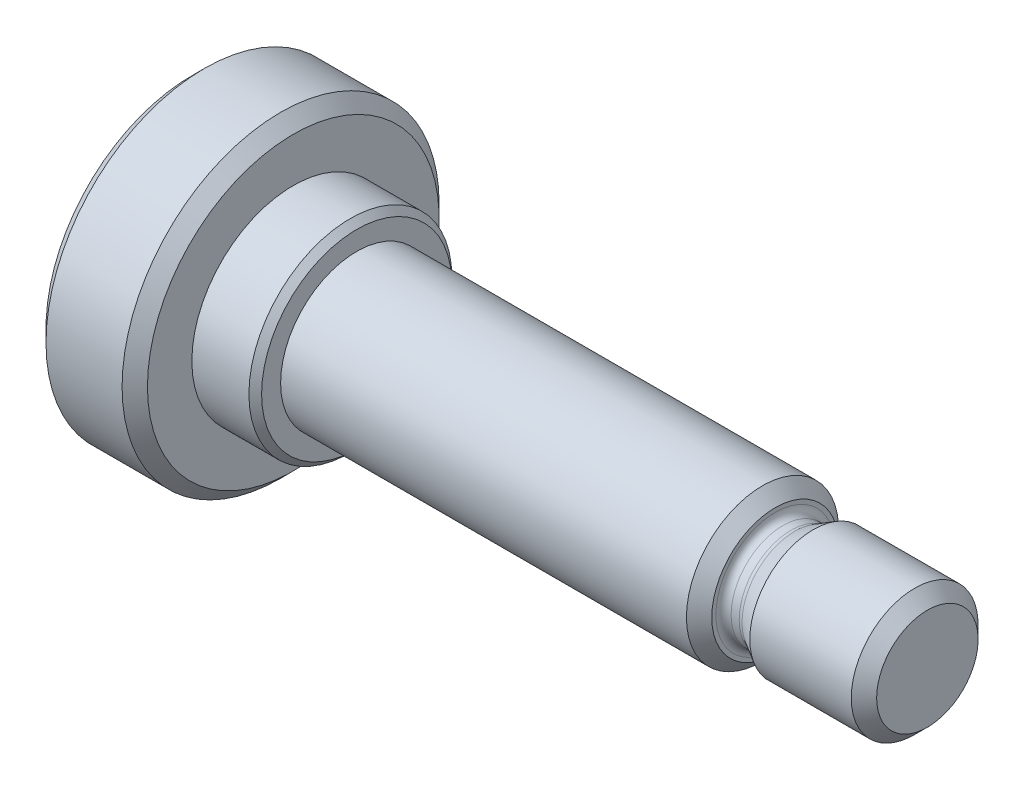
ISO-10303-21;
HEADER;
FILE_DESCRIPTION(('STEP AP214'),'2;1');
FILE_NAME('part.step','',(''),(''),'','','');
FILE_SCHEMA(('AUTOMOTIVE_DESIGN { 1 0 10303 214 1 1 1 1 }'));
ENDSEC;
DATA;
#1=APPLICATION_CONTEXT('core data for automotive mechanical design processes');
#2=APPLICATION_PROTOCOL_DEFINITION('international standard','automotive_design',2000,#1);
#3=PRODUCT_CONTEXT('',#1,'mechanical');
#4=PRODUCT('Part','Part','',(#3));
#5=PRODUCT_RELATED_PRODUCT_CATEGORY('part','',(#4));
#6=PRODUCT_DEFINITION_FORMATION('','',#4);
#7=PRODUCT_DEFINITION_CONTEXT('part definition',#1,'design');
#8=PRODUCT_DEFINITION('design','',#6,#7);
#9=PRODUCT_DEFINITION_SHAPE('','',#8);
#10=(LENGTH_UNIT() NAMED_UNIT(*) SI_UNIT(.MILLI.,.METRE.));
#11=(NAMED_UNIT(*) PLANE_ANGLE_UNIT() SI_UNIT($,.RADIAN.));
#12=(NAMED_UNIT(*) SI_UNIT($,.STERADIAN.) SOLID_ANGLE_UNIT());
#13=UNCERTAINTY_MEASURE_WITH_UNIT(LENGTH_MEASURE(1.E-05),#10,'distance_accuracy_value','');
#14=(GEOMETRIC_REPRESENTATION_CONTEXT(3) GLOBAL_UNCERTAINTY_ASSIGNED_CONTEXT((#13)) GLOBAL_UNIT_ASSIGNED_CONTEXT((#10,
#11,#12)) REPRESENTATION_CONTEXT('',''));
#15=CARTESIAN_POINT('',(0.,0.,0.));
#16=DIRECTION('',(0.,0.,1.));
#17=DIRECTION('',(1.,0.,0.));
#18=AXIS2_PLACEMENT_3D('',#15,#16,#17);
#19=CARTESIAN_POINT('',(0.,0.,0.));
#20=DIRECTION('',(1.,0.,0.));
#21=DIRECTION('',(0.,0.,-1.));
#22=AXIS2_PLACEMENT_3D('',#19,#20,#21);
#23=PLANE('',#22);
#24=CARTESIAN_POINT('',(0.,0.,0.));
#25=DIRECTION('',(1.,0.,0.));
#26=DIRECTION('',(0.,0.,-1.));
#27=AXIS2_PLACEMENT_3D('',#24,#25,#26);
#28=CIRCLE('',#27,11.5);
#29=CARTESIAN_POINT('',(0.,0.,-11.5));
#30=VERTEX_POINT('',#29);
#31=EDGE_CURVE('E76',#30,#30,#28,.F.);
#32=ORIENTED_EDGE('',*,*,#31,.T.);
#33=EDGE_LOOP('',(#32));
#34=FACE_BOUND('',#33,.T.);
#35=ADVANCED_FACE('F44',(#34),#23,.F.);
#36=CARTESIAN_POINT('',(-9.67613609633584,0.,0.));
#37=DIRECTION('',(-1.,0.,0.));
#38=DIRECTION('',(0.,0.,1.));
#39=AXIS2_PLACEMENT_3D('',#36,#37,#38);
#40=CYLINDRICAL_SURFACE('',#39,12.5);
#41=CARTESIAN_POINT('',(7.,0.,0.));
#42=DIRECTION('',(-1.,0.,0.));
#43=DIRECTION('',(0.,0.,1.));
#44=AXIS2_PLACEMENT_3D('',#41,#42,#43);
#45=CIRCLE('',#44,12.5);
#46=CARTESIAN_POINT('',(7.,0.,12.5));
#47=VERTEX_POINT('',#46);
#48=EDGE_CURVE('E81',#47,#47,#45,.T.);
#49=ORIENTED_EDGE('',*,*,#48,.T.);
#50=EDGE_LOOP('',(#49));
#51=FACE_BOUND('',#50,.T.);
#52=CARTESIAN_POINT('',(0.999999999999999,0.,0.));
#53=DIRECTION('',(1.,0.,0.));
#54=DIRECTION('',(0.,0.,-1.));
#55=AXIS2_PLACEMENT_3D('',#52,#53,#54);
#56=CIRCLE('',#55,12.5);
#57=CARTESIAN_POINT('',(0.999999999999999,0.,-12.5));
#58=VERTEX_POINT('',#57);
#59=EDGE_CURVE('E90',#58,#58,#56,.T.);
#60=ORIENTED_EDGE('',*,*,#59,.T.);
#61=EDGE_LOOP('',(#60));
#62=FACE_BOUND('',#61,.T.);
#63=ADVANCED_FACE('F121',(#51,#62),#40,.T.);
#64=CARTESIAN_POINT('',(8.,12.5,0.));
#65=DIRECTION('',(-1.,0.,0.));
#66=DIRECTION('',(0.,0.,1.));
#67=AXIS2_PLACEMENT_3D('',#64,#65,#66);
#68=PLANE('',#67);
#69=CARTESIAN_POINT('',(8.,0.,0.));
#70=DIRECTION('',(-1.,0.,0.));
#71=DIRECTION('',(0.,0.,1.));
#72=AXIS2_PLACEMENT_3D('',#69,#70,#71);
#73=CIRCLE('',#72,11.5);
#74=CARTESIAN_POINT('',(8.,0.,11.5));
#75=VERTEX_POINT('',#74);
#76=EDGE_CURVE('E82',#75,#75,#73,.F.);
#77=ORIENTED_EDGE('',*,*,#76,.T.);
#78=EDGE_LOOP('',(#77));
#79=FACE_BOUND('',#78,.T.);
#80=CARTESIAN_POINT('',(8.,0.,0.));
#81=DIRECTION('',(-1.,0.,0.));
#82=DIRECTION('',(0.,0.,1.));
#83=AXIS2_PLACEMENT_3D('',#80,#81,#82);
#84=CIRCLE('',#83,8.);
#85=CARTESIAN_POINT('',(8.,0.,8.));
#86=VERTEX_POINT('',#85);
#87=EDGE_CURVE('E98',#86,#86,#84,.T.);
#88=ORIENTED_EDGE('',*,*,#87,.T.);
#89=EDGE_LOOP('',(#88));
#90=FACE_BOUND('',#89,.T.);
#91=ADVANCED_FACE('F128',(#79,#90),#68,.F.);
#92=CARTESIAN_POINT('',(-9.67613609633584,0.,0.));
#93=DIRECTION('',(-1.,0.,0.));
#94=DIRECTION('',(0.,0.,1.));
#95=AXIS2_PLACEMENT_3D('',#92,#93,#94);
#96=CYLINDRICAL_SURFACE('',#95,8.);
#97=CARTESIAN_POINT('',(12.5,0.,0.));
#98=DIRECTION('',(-1.,0.,0.));
#99=DIRECTION('',(0.,0.,1.));
#100=AXIS2_PLACEMENT_3D('',#97,#98,#99);
#101=CIRCLE('',#100,8.);
#102=CARTESIAN_POINT('',(12.5,0.,8.));
#103=VERTEX_POINT('',#102);
#104=EDGE_CURVE('E52',#103,#103,#101,.T.);
#105=ORIENTED_EDGE('',*,*,#104,.T.);
#106=EDGE_LOOP('',(#105));
#107=FACE_BOUND('',#106,.T.);
#108=ORIENTED_EDGE('',*,*,#87,.F.);
#109=EDGE_LOOP('',(#108));
#110=FACE_BOUND('',#109,.T.);
#111=ADVANCED_FACE('F189',(#107,#110),#96,.T.);
#112=CARTESIAN_POINT('',(13.,8.,0.));
#113=DIRECTION('',(-1.,0.,0.));
#114=DIRECTION('',(0.,0.,1.));
#115=AXIS2_PLACEMENT_3D('',#112,#113,#114);
#116=PLANE('',#115);
#117=CARTESIAN_POINT('',(13.,0.,0.));
#118=DIRECTION('',(-1.,0.,0.));
#119=DIRECTION('',(0.,0.,1.));
#120=AXIS2_PLACEMENT_3D('',#117,#118,#119);
#121=CIRCLE('',#120,7.49999999999999);
#122=CARTESIAN_POINT('',(13.,0.,7.49999999999999));
#123=VERTEX_POINT('',#122);
#124=EDGE_CURVE('E10',#123,#123,#121,.F.);
#125=ORIENTED_EDGE('',*,*,#124,.T.);
#126=EDGE_LOOP('',(#125));
#127=FACE_BOUND('',#126,.T.);
#128=CARTESIAN_POINT('',(13.,0.,0.));
#129=DIRECTION('',(-1.,0.,0.));
#130=DIRECTION('',(0.,0.,1.));
#131=AXIS2_PLACEMENT_3D('',#128,#129,#130);
#132=CIRCLE('',#131,6.);
#133=CARTESIAN_POINT('',(13.,0.,6.));
#134=VERTEX_POINT('',#133);
#135=EDGE_CURVE('E100',#134,#134,#132,.T.);
#136=ORIENTED_EDGE('',*,*,#135,.T.);
#137=EDGE_LOOP('',(#136));
#138=FACE_BOUND('',#137,.T.);
#139=ADVANCED_FACE('F182',(#127,#138),#116,.F.);
#140=CARTESIAN_POINT('',(-9.67613609633584,0.,0.));
#141=DIRECTION('',(-1.,0.,0.));
#142=DIRECTION('',(0.,0.,1.));
#143=AXIS2_PLACEMENT_3D('',#140,#141,#142);
#144=CYLINDRICAL_SURFACE('',#143,6.);
#145=CARTESIAN_POINT('',(45.,0.,0.));
#146=DIRECTION('',(-1.,0.,0.));
#147=DIRECTION('',(0.,0.,1.));
#148=AXIS2_PLACEMENT_3D('',#145,#146,#147);
#149=CIRCLE('',#148,6.);
#150=CARTESIAN_POINT('',(45.,0.,6.));
#151=VERTEX_POINT('',#150);
#152=EDGE_CURVE('E94',#151,#151,#149,.T.);
#153=ORIENTED_EDGE('',*,*,#152,.T.);
#154=EDGE_LOOP('',(#153));
#155=FACE_BOUND('',#154,.T.);
#156=ORIENTED_EDGE('',*,*,#135,.F.);
#157=EDGE_LOOP('',(#156));
#158=FACE_BOUND('',#157,.T.);
#159=ADVANCED_FACE('F190',(#155,#158),#144,.T.);
#160=CARTESIAN_POINT('',(46.,6.,0.));
#161=DIRECTION('',(-1.,0.,0.));
#162=DIRECTION('',(0.,0.,1.));
#163=AXIS2_PLACEMENT_3D('',#160,#161,#162);
#164=PLANE('',#163);
#165=CARTESIAN_POINT('',(46.,0.,0.));
#166=DIRECTION('',(-1.,0.,0.));
#167=DIRECTION('',(0.,0.,1.));
#168=AXIS2_PLACEMENT_3D('',#165,#166,#167);
#169=CIRCLE('',#168,4.67623956929661);
#170=CARTESIAN_POINT('',(46.,0.,4.67623956929661));
#171=VERTEX_POINT('',#170);
#172=EDGE_CURVE('E66',#171,#171,#169,.T.);
#173=ORIENTED_EDGE('',*,*,#172,.T.);
#174=EDGE_LOOP('',(#173));
#175=FACE_BOUND('',#174,.T.);
#176=CARTESIAN_POINT('',(46.,0.,0.));
#177=DIRECTION('',(-1.,0.,0.));
#178=DIRECTION('',(0.,0.,1.));
#179=AXIS2_PLACEMENT_3D('',#176,#177,#178);
#180=CIRCLE('',#179,4.99999999999998);
#181=CARTESIAN_POINT('',(46.,0.,4.99999999999998));
#182=VERTEX_POINT('',#181);
#183=EDGE_CURVE('E89',#182,#182,#180,.F.);
#184=ORIENTED_EDGE('',*,*,#183,.T.);
#185=EDGE_LOOP('',(#184));
#186=FACE_BOUND('',#185,.T.);
#187=ADVANCED_FACE('F238',(#175,#186),#164,.F.);
#188=CARTESIAN_POINT('',(-9.67613609633584,0.,0.));
#189=DIRECTION('',(-1.,0.,0.));
#190=DIRECTION('',(0.,0.,1.));
#191=AXIS2_PLACEMENT_3D('',#188,#189,#190);
#192=CYLINDRICAL_SURFACE('',#191,4.07623956929661);
#193=CARTESIAN_POINT('',(47.2392304845413,0.,0.));
#194=DIRECTION('',(-1.,0.,0.));
#195=DIRECTION('',(0.,0.,1.));
#196=AXIS2_PLACEMENT_3D('',#193,#194,#195);
#197=CIRCLE('',#196,4.07623956929661);
#198=CARTESIAN_POINT('',(47.2392304845413,0.,4.07623956929661));
#199=VERTEX_POINT('',#198);
#200=EDGE_CURVE('E72',#199,#199,#197,.T.);
#201=ORIENTED_EDGE('',*,*,#200,.T.);
#202=EDGE_LOOP('',(#201));
#203=FACE_BOUND('',#202,.T.);
#204=CARTESIAN_POINT('',(46.6,0.,0.));
#205=DIRECTION('',(-1.,0.,0.));
#206=DIRECTION('',(0.,0.,1.));
#207=AXIS2_PLACEMENT_3D('',#204,#205,#206);
#208=CIRCLE('',#207,4.07623956929661);
#209=CARTESIAN_POINT('',(46.6,0.,4.07623956929661));
#210=VERTEX_POINT('',#209);
#211=EDGE_CURVE('E75',#210,#210,#208,.F.);
#212=ORIENTED_EDGE('',*,*,#211,.T.);
#213=EDGE_LOOP('',(#212));
#214=FACE_BOUND('',#213,.T.);
#215=ADVANCED_FACE('F119',(#203,#214),#192,.T.);
#216=CARTESIAN_POINT('',(49.,0.,0.));
#217=DIRECTION('',(1.,0.,0.));
#218=DIRECTION('',(0.,0.,-1.));
#219=AXIS2_PLACEMENT_3D('',#216,#217,#218);
#220=CONICAL_SURFACE('',#219,5.,0.523598775598293);
#221=CARTESIAN_POINT('',(47.5392304845413,0.,0.));
#222=DIRECTION('',(1.,0.,0.));
#223=DIRECTION('',(0.,0.,-1.));
#224=AXIS2_PLACEMENT_3D('',#221,#222,#223);
#225=CIRCLE('',#224,4.15662432702595);
#226=CARTESIAN_POINT('',(47.5392304845413,0.,-4.15662432702595));
#227=VERTEX_POINT('',#226);
#228=EDGE_CURVE('E68',#227,#227,#225,.T.);
#229=ORIENTED_EDGE('',*,*,#228,.T.);
#230=EDGE_LOOP('',(#229));
#231=FACE_BOUND('',#230,.T.);
#232=CARTESIAN_POINT('',(49.,0.,0.));
#233=DIRECTION('',(-1.,0.,0.));
#234=DIRECTION('',(0.,0.,1.));
#235=AXIS2_PLACEMENT_3D('',#232,#233,#234);
#236=CIRCLE('',#235,5.);
#237=CARTESIAN_POINT('',(49.,0.,5.));
#238=VERTEX_POINT('',#237);
#239=EDGE_CURVE('E105',#238,#238,#236,.T.);
#240=ORIENTED_EDGE('',*,*,#239,.T.);
#241=EDGE_LOOP('',(#240));
#242=FACE_BOUND('',#241,.T.);
#243=ADVANCED_FACE('F106',(#231,#242),#220,.T.);
#244=CARTESIAN_POINT('',(-9.67613609633584,0.,0.));
#245=DIRECTION('',(-1.,0.,0.));
#246=DIRECTION('',(0.,0.,1.));
#247=AXIS2_PLACEMENT_3D('',#244,#245,#246);
#248=CYLINDRICAL_SURFACE('',#247,5.);
#249=CARTESIAN_POINT('',(57.,0.,0.));
#250=DIRECTION('',(-1.,0.,0.));
#251=DIRECTION('',(0.,0.,1.));
#252=AXIS2_PLACEMENT_3D('',#249,#250,#251);
#253=CIRCLE('',#252,5.);
#254=CARTESIAN_POINT('',(57.,0.,5.));
#255=VERTEX_POINT('',#254);
#256=EDGE_CURVE('E62',#255,#255,#253,.T.);
#257=ORIENTED_EDGE('',*,*,#256,.T.);
#258=EDGE_LOOP('',(#257));
#259=FACE_BOUND('',#258,.T.);
#260=ORIENTED_EDGE('',*,*,#239,.F.);
#261=EDGE_LOOP('',(#260));
#262=FACE_BOUND('',#261,.T.);
#263=ADVANCED_FACE('F108',(#259,#262),#248,.T.);
#264=CARTESIAN_POINT('',(58.,5.,0.));
#265=DIRECTION('',(-1.,0.,0.));
#266=DIRECTION('',(0.,0.,1.));
#267=AXIS2_PLACEMENT_3D('',#264,#265,#266);
#268=PLANE('',#267);
#269=CARTESIAN_POINT('',(58.,0.,0.));
#270=DIRECTION('',(-1.,0.,0.));
#271=DIRECTION('',(0.,0.,1.));
#272=AXIS2_PLACEMENT_3D('',#269,#270,#271);
#273=CIRCLE('',#272,3.99999999999999);
#274=CARTESIAN_POINT('',(58.,0.,3.99999999999999));
#275=VERTEX_POINT('',#274);
#276=EDGE_CURVE('E60',#275,#275,#273,.F.);
#277=ORIENTED_EDGE('',*,*,#276,.T.);
#278=EDGE_LOOP('',(#277));
#279=FACE_BOUND('',#278,.T.);
#280=ADVANCED_FACE('F109',(#279),#268,.F.);
#281=CARTESIAN_POINT('',(45.,0.,0.));
#282=DIRECTION('',(-1.,0.,0.));
#283=DIRECTION('',(0.,0.,1.));
#284=AXIS2_PLACEMENT_3D('',#281,#282,#283);
#285=CONICAL_SURFACE('',#284,6.,0.78539816339746);
#286=ORIENTED_EDGE('',*,*,#183,.F.);
#287=EDGE_LOOP('',(#286));
#288=FACE_BOUND('',#287,.T.);
#289=ORIENTED_EDGE('',*,*,#152,.F.);
#290=EDGE_LOOP('',(#289));
#291=FACE_BOUND('',#290,.T.);
#292=ADVANCED_FACE('F116',(#288,#291),#285,.T.);
#293=CARTESIAN_POINT('',(7.,0.,0.));
#294=DIRECTION('',(-1.,0.,0.));
#295=DIRECTION('',(0.,0.,1.));
#296=AXIS2_PLACEMENT_3D('',#293,#294,#295);
#297=CONICAL_SURFACE('',#296,12.5,0.78539816339745);
#298=ORIENTED_EDGE('',*,*,#76,.F.);
#299=EDGE_LOOP('',(#298));
#300=FACE_BOUND('',#299,.T.);
#301=ORIENTED_EDGE('',*,*,#48,.F.);
#302=EDGE_LOOP('',(#301));
#303=FACE_BOUND('',#302,.T.);
#304=ADVANCED_FACE('F142',(#300,#303),#297,.T.);
#305=CARTESIAN_POINT('',(0.,0.,0.));
#306=DIRECTION('',(1.,0.,0.));
#307=DIRECTION('',(0.,0.,-1.));
#308=AXIS2_PLACEMENT_3D('',#305,#306,#307);
#309=CONICAL_SURFACE('',#308,11.5,0.785398163397444);
#310=ORIENTED_EDGE('',*,*,#59,.F.);
#311=EDGE_LOOP('',(#310));
#312=FACE_BOUND('',#311,.T.);
#313=ORIENTED_EDGE('',*,*,#31,.F.);
#314=EDGE_LOOP('',(#313));
#315=FACE_BOUND('',#314,.T.);
#316=ADVANCED_FACE('F149',(#312,#315),#309,.T.);
#317=CARTESIAN_POINT('',(47.2392304845413,0.,0.));
#318=DIRECTION('',(-1.,0.,0.));
#319=DIRECTION('',(0.,0.,1.));
#320=AXIS2_PLACEMENT_3D('',#317,#318,#319);
#321=TOROIDAL_SURFACE('',#320,4.67623956929661,0.6);
#322=ORIENTED_EDGE('',*,*,#228,.F.);
#323=EDGE_LOOP('',(#322));
#324=FACE_BOUND('',#323,.T.);
#325=ORIENTED_EDGE('',*,*,#200,.F.);
#326=EDGE_LOOP('',(#325));
#327=FACE_BOUND('',#326,.T.);
#328=ADVANCED_FACE('F154',(#324,#327),#321,.F.);
#329=CARTESIAN_POINT('',(46.6,0.,0.));
#330=DIRECTION('',(-1.,0.,0.));
#331=DIRECTION('',(0.,0.,1.));
#332=AXIS2_PLACEMENT_3D('',#329,#330,#331);
#333=TOROIDAL_SURFACE('',#332,4.67623956929661,0.6);
#334=ORIENTED_EDGE('',*,*,#211,.F.);
#335=EDGE_LOOP('',(#334));
#336=FACE_BOUND('',#335,.T.);
#337=ORIENTED_EDGE('',*,*,#172,.F.);
#338=EDGE_LOOP('',(#337));
#339=FACE_BOUND('',#338,.T.);
#340=ADVANCED_FACE('F158',(#336,#339),#333,.F.);
#341=CARTESIAN_POINT('',(57.,0.,0.));
#342=DIRECTION('',(-1.,0.,0.));
#343=DIRECTION('',(0.,0.,1.));
#344=AXIS2_PLACEMENT_3D('',#341,#342,#343);
#345=CONICAL_SURFACE('',#344,5.,0.785398163397453);
#346=ORIENTED_EDGE('',*,*,#276,.F.);
#347=EDGE_LOOP('',(#346));
#348=FACE_BOUND('',#347,.T.);
#349=ORIENTED_EDGE('',*,*,#256,.F.);
#350=EDGE_LOOP('',(#349));
#351=FACE_BOUND('',#350,.T.);
#352=ADVANCED_FACE('F162',(#348,#351),#345,.T.);
#353=CARTESIAN_POINT('',(12.5,0.,0.));
#354=DIRECTION('',(-1.,0.,0.));
#355=DIRECTION('',(0.,0.,1.));
#356=AXIS2_PLACEMENT_3D('',#353,#354,#355);
#357=CONICAL_SURFACE('',#356,8.,0.785398163397448);
#358=ORIENTED_EDGE('',*,*,#124,.F.);
#359=EDGE_LOOP('',(#358));
#360=FACE_BOUND('',#359,.T.);
#361=ORIENTED_EDGE('',*,*,#104,.F.);
#362=EDGE_LOOP('',(#361));
#363=FACE_BOUND('',#362,.T.);
#364=ADVANCED_FACE('F48',(#360,#363),#357,.T.);
#365=CLOSED_SHELL('',(#35,#63,#91,#111,#139,#159,#187,#215,#243,#263,#280,#292,#304,#316,#328,
#340,#352,#364));
#366=MANIFOLD_SOLID_BREP('B2',#365);
#367=ADVANCED_BREP_SHAPE_REPRESENTATION('',(#18,#366),#14);
#368=SHAPE_DEFINITION_REPRESENTATION(#9,#367);
ENDSEC;
END-ISO-10303-21;
